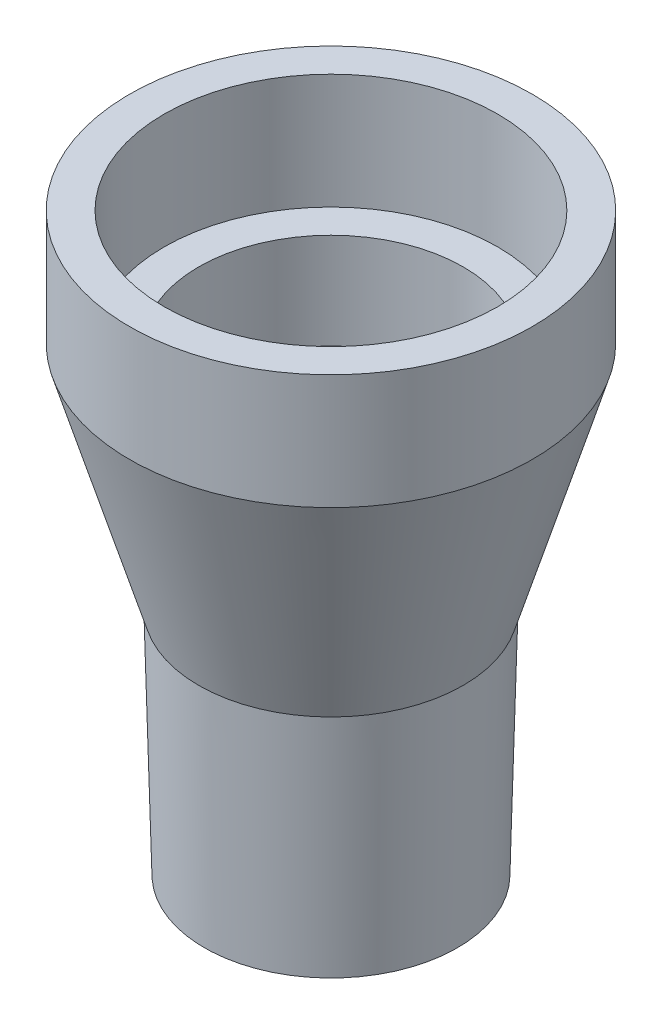
ISO-10303-21;
HEADER;
FILE_DESCRIPTION(('STEP AP214'),'2;1');
FILE_NAME('part.step','',(''),(''),'','','');
FILE_SCHEMA(('AUTOMOTIVE_DESIGN { 1 0 10303 214 1 1 1 1 }'));
ENDSEC;
DATA;
#1=APPLICATION_CONTEXT('core data for automotive mechanical design processes');
#2=APPLICATION_PROTOCOL_DEFINITION('international standard','automotive_design',2000,#1);
#3=PRODUCT_CONTEXT('',#1,'mechanical');
#4=PRODUCT('Part','Part','',(#3));
#5=PRODUCT_RELATED_PRODUCT_CATEGORY('part','',(#4));
#6=PRODUCT_DEFINITION_FORMATION('','',#4);
#7=PRODUCT_DEFINITION_CONTEXT('part definition',#1,'design');
#8=PRODUCT_DEFINITION('design','',#6,#7);
#9=PRODUCT_DEFINITION_SHAPE('','',#8);
#10=(LENGTH_UNIT() NAMED_UNIT(*) SI_UNIT(.MILLI.,.METRE.));
#11=(NAMED_UNIT(*) PLANE_ANGLE_UNIT() SI_UNIT($,.RADIAN.));
#12=(NAMED_UNIT(*) SI_UNIT($,.STERADIAN.) SOLID_ANGLE_UNIT());
#13=UNCERTAINTY_MEASURE_WITH_UNIT(LENGTH_MEASURE(1.E-05),#10,'distance_accuracy_value','');
#14=(GEOMETRIC_REPRESENTATION_CONTEXT(3) GLOBAL_UNCERTAINTY_ASSIGNED_CONTEXT((#13)) GLOBAL_UNIT_ASSIGNED_CONTEXT((#10,
#11,#12)) REPRESENTATION_CONTEXT('',''));
#15=CARTESIAN_POINT('',(0.,0.,0.));
#16=DIRECTION('',(0.,0.,1.));
#17=DIRECTION('',(1.,0.,0.));
#18=AXIS2_PLACEMENT_3D('',#15,#16,#17);
#19=CARTESIAN_POINT('',(0.,0.,0.));
#20=DIRECTION('',(0.,-1.,0.));
#21=DIRECTION('',(0.,0.,-1.));
#22=AXIS2_PLACEMENT_3D('',#19,#20,#21);
#23=CYLINDRICAL_SURFACE('',#22,7.99999999999999);
#24=CARTESIAN_POINT('',(0.,0.,0.));
#25=DIRECTION('',(0.,-1.,0.));
#26=DIRECTION('',(0.,0.,-1.));
#27=AXIS2_PLACEMENT_3D('',#24,#25,#26);
#28=CIRCLE('',#27,7.99999999999999);
#29=CARTESIAN_POINT('',(0.,0.,-7.99999999999999));
#30=VERTEX_POINT('',#29);
#31=EDGE_CURVE('E65',#30,#30,#28,.T.);
#32=ORIENTED_EDGE('',*,*,#31,.T.);
#33=EDGE_LOOP('',(#32));
#34=FACE_BOUND('',#33,.T.);
#35=CARTESIAN_POINT('',(0.,20.,0.));
#36=DIRECTION('',(0.,-1.,0.));
#37=DIRECTION('',(0.,0.,-1.));
#38=AXIS2_PLACEMENT_3D('',#35,#36,#37);
#39=CIRCLE('',#38,7.99999999999999);
#40=CARTESIAN_POINT('',(0.,20.,-7.99999999999999));
#41=VERTEX_POINT('',#40);
#42=EDGE_CURVE('E10',#41,#41,#39,.T.);
#43=ORIENTED_EDGE('',*,*,#42,.F.);
#44=EDGE_LOOP('',(#43));
#45=FACE_BOUND('',#44,.T.);
#46=ADVANCED_FACE('F31',(#34,#45),#23,.F.);
#47=CARTESIAN_POINT('',(0.,31.6666666666667,0.));
#48=DIRECTION('',(0.,1.,0.));
#49=DIRECTION('',(0.,0.,1.));
#50=AXIS2_PLACEMENT_3D('',#47,#48,#49);
#51=CONICAL_SURFACE('',#50,11.5,0.291456794477868);
#52=ORIENTED_EDGE('',*,*,#42,.T.);
#53=EDGE_LOOP('',(#52));
#54=FACE_BOUND('',#53,.T.);
#55=CARTESIAN_POINT('',(0.,31.6666666666667,0.));
#56=DIRECTION('',(0.,-1.,0.));
#57=DIRECTION('',(0.,0.,-1.));
#58=AXIS2_PLACEMENT_3D('',#55,#56,#57);
#59=CIRCLE('',#58,11.5);
#60=CARTESIAN_POINT('',(0.,31.6666666666667,-11.5));
#61=VERTEX_POINT('',#60);
#62=EDGE_CURVE('E37',#61,#61,#59,.T.);
#63=ORIENTED_EDGE('',*,*,#62,.F.);
#64=EDGE_LOOP('',(#63));
#65=FACE_BOUND('',#64,.T.);
#66=ADVANCED_FACE('F83',(#54,#65),#51,.F.);
#67=CARTESIAN_POINT('',(0.,0.,0.));
#68=DIRECTION('',(0.,-1.,0.));
#69=DIRECTION('',(0.,0.,-1.));
#70=AXIS2_PLACEMENT_3D('',#67,#68,#69);
#71=CYLINDRICAL_SURFACE('',#70,11.5);
#72=ORIENTED_EDGE('',*,*,#62,.T.);
#73=EDGE_LOOP('',(#72));
#74=FACE_BOUND('',#73,.T.);
#75=CARTESIAN_POINT('',(0.,40.,0.));
#76=DIRECTION('',(0.,-1.,0.));
#77=DIRECTION('',(0.,0.,-1.));
#78=AXIS2_PLACEMENT_3D('',#75,#76,#77);
#79=CIRCLE('',#78,11.5);
#80=CARTESIAN_POINT('',(0.,40.,-11.5));
#81=VERTEX_POINT('',#80);
#82=EDGE_CURVE('E41',#81,#81,#79,.T.);
#83=ORIENTED_EDGE('',*,*,#82,.F.);
#84=EDGE_LOOP('',(#83));
#85=FACE_BOUND('',#84,.T.);
#86=ADVANCED_FACE('F87',(#74,#85),#71,.F.);
#87=CARTESIAN_POINT('',(14.5,40.,0.));
#88=DIRECTION('',(0.,1.,0.));
#89=DIRECTION('',(0.,0.,1.));
#90=AXIS2_PLACEMENT_3D('',#87,#88,#89);
#91=PLANE('',#90);
#92=ORIENTED_EDGE('',*,*,#82,.T.);
#93=EDGE_LOOP('',(#92));
#94=FACE_BOUND('',#93,.T.);
#95=CARTESIAN_POINT('',(0.,40.,0.));
#96=DIRECTION('',(0.,-1.,0.));
#97=DIRECTION('',(0.,0.,-1.));
#98=AXIS2_PLACEMENT_3D('',#95,#96,#97);
#99=CIRCLE('',#98,14.5);
#100=CARTESIAN_POINT('',(0.,40.,-14.5));
#101=VERTEX_POINT('',#100);
#102=EDGE_CURVE('E45',#101,#101,#99,.T.);
#103=ORIENTED_EDGE('',*,*,#102,.F.);
#104=EDGE_LOOP('',(#103));
#105=FACE_BOUND('',#104,.T.);
#106=ADVANCED_FACE('F91',(#94,#105),#91,.T.);
#107=CARTESIAN_POINT('',(0.,0.,0.));
#108=DIRECTION('',(0.,-1.,0.));
#109=DIRECTION('',(0.,0.,-1.));
#110=AXIS2_PLACEMENT_3D('',#107,#108,#109);
#111=CYLINDRICAL_SURFACE('',#110,14.5);
#112=ORIENTED_EDGE('',*,*,#102,.T.);
#113=EDGE_LOOP('',(#112));
#114=FACE_BOUND('',#113,.T.);
#115=CARTESIAN_POINT('',(0.,50.,0.));
#116=DIRECTION('',(0.,-1.,0.));
#117=DIRECTION('',(0.,0.,-1.));
#118=AXIS2_PLACEMENT_3D('',#115,#116,#117);
#119=CIRCLE('',#118,14.5);
#120=CARTESIAN_POINT('',(0.,50.,-14.5));
#121=VERTEX_POINT('',#120);
#122=EDGE_CURVE('E50',#121,#121,#119,.T.);
#123=ORIENTED_EDGE('',*,*,#122,.F.);
#124=EDGE_LOOP('',(#123));
#125=FACE_BOUND('',#124,.T.);
#126=ADVANCED_FACE('F97',(#114,#125),#111,.F.);
#127=CARTESIAN_POINT('',(14.5,50.,0.));
#128=DIRECTION('',(0.,1.,0.));
#129=DIRECTION('',(0.,0.,1.));
#130=AXIS2_PLACEMENT_3D('',#127,#128,#129);
#131=PLANE('',#130);
#132=ORIENTED_EDGE('',*,*,#122,.T.);
#133=EDGE_LOOP('',(#132));
#134=FACE_BOUND('',#133,.T.);
#135=CARTESIAN_POINT('',(0.,50.,0.));
#136=DIRECTION('',(0.,-1.,0.));
#137=DIRECTION('',(0.,0.,-1.));
#138=AXIS2_PLACEMENT_3D('',#135,#136,#137);
#139=CIRCLE('',#138,17.5);
#140=CARTESIAN_POINT('',(0.,50.,-17.5));
#141=VERTEX_POINT('',#140);
#142=EDGE_CURVE('E53',#141,#141,#139,.T.);
#143=ORIENTED_EDGE('',*,*,#142,.F.);
#144=EDGE_LOOP('',(#143));
#145=FACE_BOUND('',#144,.T.);
#146=ADVANCED_FACE('F101',(#134,#145),#131,.T.);
#147=CARTESIAN_POINT('',(0.,0.,0.));
#148=DIRECTION('',(0.,-1.,0.));
#149=DIRECTION('',(0.,0.,-1.));
#150=AXIS2_PLACEMENT_3D('',#147,#148,#149);
#151=CYLINDRICAL_SURFACE('',#150,17.5);
#152=ORIENTED_EDGE('',*,*,#142,.T.);
#153=EDGE_LOOP('',(#152));
#154=FACE_BOUND('',#153,.T.);
#155=CARTESIAN_POINT('',(0.,40.,0.));
#156=DIRECTION('',(0.,-1.,0.));
#157=DIRECTION('',(0.,0.,-1.));
#158=AXIS2_PLACEMENT_3D('',#155,#156,#157);
#159=CIRCLE('',#158,17.5);
#160=CARTESIAN_POINT('',(0.,40.,-17.5));
#161=VERTEX_POINT('',#160);
#162=EDGE_CURVE('E56',#161,#161,#159,.T.);
#163=ORIENTED_EDGE('',*,*,#162,.F.);
#164=EDGE_LOOP('',(#163));
#165=FACE_BOUND('',#164,.T.);
#166=ADVANCED_FACE('F105',(#154,#165),#151,.T.);
#167=CARTESIAN_POINT('',(0.,20.,0.));
#168=DIRECTION('',(0.,1.,0.));
#169=DIRECTION('',(0.,0.,1.));
#170=AXIS2_PLACEMENT_3D('',#167,#168,#169);
#171=CONICAL_SURFACE('',#170,11.5,0.291456794477867);
#172=ORIENTED_EDGE('',*,*,#162,.T.);
#173=EDGE_LOOP('',(#172));
#174=FACE_BOUND('',#173,.T.);
#175=CARTESIAN_POINT('',(0.,20.,0.));
#176=DIRECTION('',(0.,-1.,0.));
#177=DIRECTION('',(0.,0.,-1.));
#178=AXIS2_PLACEMENT_3D('',#175,#176,#177);
#179=CIRCLE('',#178,11.5);
#180=CARTESIAN_POINT('',(0.,20.,-11.5));
#181=VERTEX_POINT('',#180);
#182=EDGE_CURVE('E59',#181,#181,#179,.T.);
#183=ORIENTED_EDGE('',*,*,#182,.F.);
#184=EDGE_LOOP('',(#183));
#185=FACE_BOUND('',#184,.T.);
#186=ADVANCED_FACE('F79',(#174,#185),#171,.T.);
#187=CARTESIAN_POINT('',(0.,0.,0.));
#188=DIRECTION('',(0.,1.,0.));
#189=DIRECTION('',(0.,0.,1.));
#190=AXIS2_PLACEMENT_3D('',#187,#188,#189);
#191=CONICAL_SURFACE('',#190,11.,0.0249947936189202);
#192=ORIENTED_EDGE('',*,*,#182,.T.);
#193=EDGE_LOOP('',(#192));
#194=FACE_BOUND('',#193,.T.);
#195=CARTESIAN_POINT('',(0.,0.,0.));
#196=DIRECTION('',(0.,-1.,0.));
#197=DIRECTION('',(0.,0.,-1.));
#198=AXIS2_PLACEMENT_3D('',#195,#196,#197);
#199=CIRCLE('',#198,11.);
#200=CARTESIAN_POINT('',(0.,0.,-11.));
#201=VERTEX_POINT('',#200);
#202=EDGE_CURVE('E62',#201,#201,#199,.T.);
#203=ORIENTED_EDGE('',*,*,#202,.F.);
#204=EDGE_LOOP('',(#203));
#205=FACE_BOUND('',#204,.T.);
#206=ADVANCED_FACE('F73',(#194,#205),#191,.T.);
#207=CARTESIAN_POINT('',(11.,0.,0.));
#208=DIRECTION('',(0.,-1.,0.));
#209=DIRECTION('',(0.,0.,-1.));
#210=AXIS2_PLACEMENT_3D('',#207,#208,#209);
#211=PLANE('',#210);
#212=ORIENTED_EDGE('',*,*,#202,.T.);
#213=EDGE_LOOP('',(#212));
#214=FACE_BOUND('',#213,.T.);
#215=ORIENTED_EDGE('',*,*,#31,.F.);
#216=EDGE_LOOP('',(#215));
#217=FACE_BOUND('',#216,.T.);
#218=ADVANCED_FACE('F71',(#214,#217),#211,.T.);
#219=CLOSED_SHELL('',(#46,#66,#86,#106,#126,#146,#166,#186,#206,#218));
#220=MANIFOLD_SOLID_BREP('B2',#219);
#221=ADVANCED_BREP_SHAPE_REPRESENTATION('',(#18,#220),#14);
#222=SHAPE_DEFINITION_REPRESENTATION(#9,#221);
ENDSEC;
END-ISO-10303-21;
